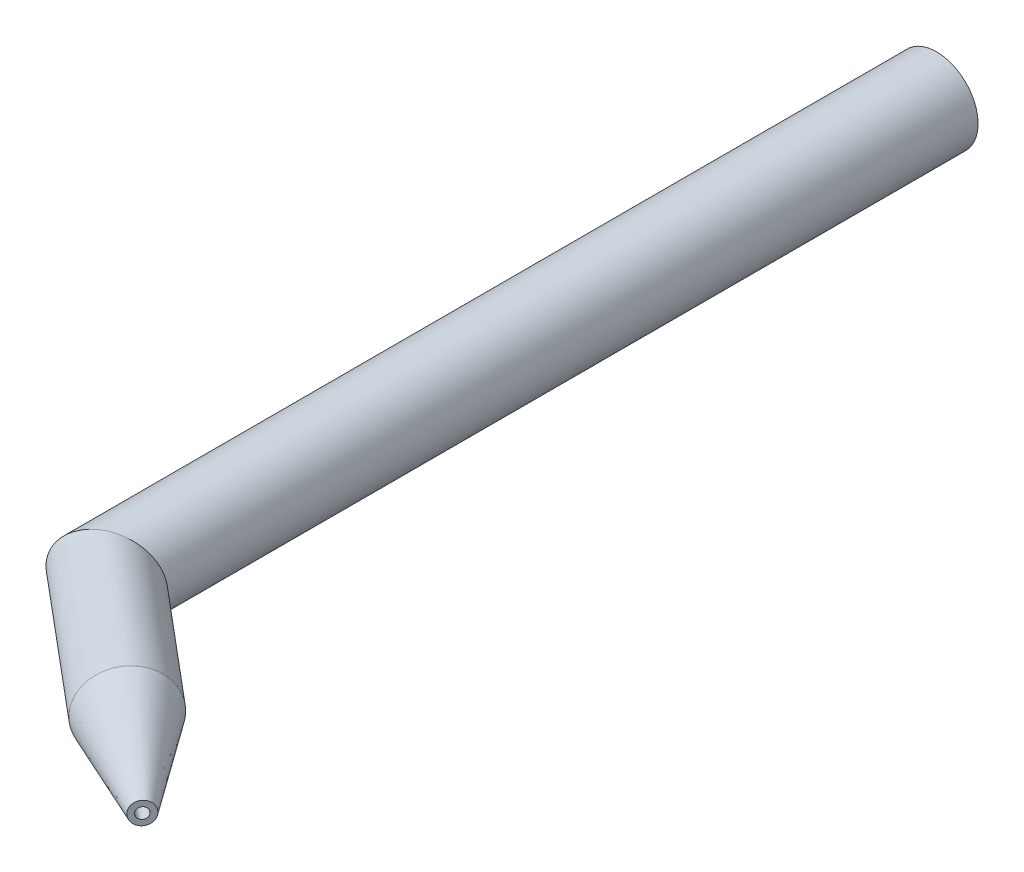
ISO-10303-21;
HEADER;
FILE_DESCRIPTION(('STEP AP214'),'2;1');
FILE_NAME('part.step','',(''),(''),'','','');
FILE_SCHEMA(('AUTOMOTIVE_DESIGN { 1 0 10303 214 1 1 1 1 }'));
ENDSEC;
DATA;
#1=APPLICATION_CONTEXT('core data for automotive mechanical design processes');
#2=APPLICATION_PROTOCOL_DEFINITION('international standard','automotive_design',2000,#1);
#3=PRODUCT_CONTEXT('',#1,'mechanical');
#4=PRODUCT('Part','Part','',(#3));
#5=PRODUCT_RELATED_PRODUCT_CATEGORY('part','',(#4));
#6=PRODUCT_DEFINITION_FORMATION('','',#4);
#7=PRODUCT_DEFINITION_CONTEXT('part definition',#1,'design');
#8=PRODUCT_DEFINITION('design','',#6,#7);
#9=PRODUCT_DEFINITION_SHAPE('','',#8);
#10=(LENGTH_UNIT() NAMED_UNIT(*) SI_UNIT(.MILLI.,.METRE.));
#11=(NAMED_UNIT(*) PLANE_ANGLE_UNIT() SI_UNIT($,.RADIAN.));
#12=(NAMED_UNIT(*) SI_UNIT($,.STERADIAN.) SOLID_ANGLE_UNIT());
#13=UNCERTAINTY_MEASURE_WITH_UNIT(LENGTH_MEASURE(1.E-05),#10,'distance_accuracy_value','');
#14=(GEOMETRIC_REPRESENTATION_CONTEXT(3) GLOBAL_UNCERTAINTY_ASSIGNED_CONTEXT((#13)) GLOBAL_UNIT_ASSIGNED_CONTEXT((#10,
#11,#12)) REPRESENTATION_CONTEXT('',''));
#15=CARTESIAN_POINT('',(0.,0.,0.));
#16=DIRECTION('',(0.,0.,1.));
#17=DIRECTION('',(1.,0.,0.));
#18=AXIS2_PLACEMENT_3D('',#15,#16,#17);
#19=CARTESIAN_POINT('',(0.,0.,100.));
#20=DIRECTION('',(0.,0.,-1.));
#21=DIRECTION('',(-1.,0.,0.));
#22=AXIS2_PLACEMENT_3D('',#19,#20,#21);
#23=CYLINDRICAL_SURFACE('',#22,7.5);
#24=CARTESIAN_POINT('',(0.,0.,130.));
#25=DIRECTION('',(0.422618261740702,0.,0.906307787036648));
#26=DIRECTION('',(-0.906307787036649,0.,0.422618261740702));
#27=AXIS2_PLACEMENT_3D('',#24,#25,#26);
#28=ELLIPSE('',#27,8.2753343922187,7.5);
#29=CARTESIAN_POINT('',(-7.49999999999998,0.,133.497307436163));
#30=VERTEX_POINT('',#29);
#31=EDGE_CURVE('E40',#30,#30,#28,.F.);
#32=ORIENTED_EDGE('',*,*,#31,.T.);
#33=EDGE_LOOP('',(#32));
#34=FACE_BOUND('',#33,.T.);
#35=CARTESIAN_POINT('',(0.,0.,-20.));
#36=DIRECTION('',(0.,0.,-1.));
#37=DIRECTION('',(-1.,0.,0.));
#38=AXIS2_PLACEMENT_3D('',#35,#36,#37);
#39=CIRCLE('',#38,7.5);
#40=CARTESIAN_POINT('',(-7.5,0.,-20.));
#41=VERTEX_POINT('',#40);
#42=EDGE_CURVE('E76',#41,#41,#39,.T.);
#43=ORIENTED_EDGE('',*,*,#42,.F.);
#44=EDGE_LOOP('',(#43));
#45=FACE_BOUND('',#44,.T.);
#46=ADVANCED_FACE('F37',(#34,#45),#23,.T.);
#47=CARTESIAN_POINT('',(0.,0.,100.));
#48=DIRECTION('',(0.,0.,-1.));
#49=DIRECTION('',(-1.,0.,0.));
#50=AXIS2_PLACEMENT_3D('',#47,#48,#49);
#51=CYLINDRICAL_SURFACE('',#50,4.5);
#52=CARTESIAN_POINT('',(0.,0.,130.));
#53=DIRECTION('',(0.422618261740702,0.,0.906307787036649));
#54=DIRECTION('',(-0.906307787036649,0.,0.422618261740702));
#55=AXIS2_PLACEMENT_3D('',#52,#53,#54);
#56=ELLIPSE('',#55,4.96520063533122,4.5);
#57=CARTESIAN_POINT('',(-4.49999999999998,0.,132.098384461698));
#58=VERTEX_POINT('',#57);
#59=EDGE_CURVE('E10',#58,#58,#56,.T.);
#60=ORIENTED_EDGE('',*,*,#59,.T.);
#61=EDGE_LOOP('',(#60));
#62=FACE_BOUND('',#61,.T.);
#63=CARTESIAN_POINT('',(0.,0.,-20.));
#64=DIRECTION('',(0.,0.,-1.));
#65=DIRECTION('',(-1.,0.,0.));
#66=AXIS2_PLACEMENT_3D('',#63,#64,#65);
#67=CIRCLE('',#66,4.5);
#68=CARTESIAN_POINT('',(-4.5,0.,-20.));
#69=VERTEX_POINT('',#68);
#70=EDGE_CURVE('E82',#69,#69,#67,.T.);
#71=ORIENTED_EDGE('',*,*,#70,.T.);
#72=EDGE_LOOP('',(#71));
#73=FACE_BOUND('',#72,.T.);
#74=ADVANCED_FACE('F87',(#62,#73),#51,.F.);
#75=CARTESIAN_POINT('',(-3.02360666439797,0.,127.462892763079));
#76=DIRECTION('',(0.766044443118982,0.,0.642787609686535));
#77=DIRECTION('',(0.642787609686535,0.,-0.766044443118982));
#78=AXIS2_PLACEMENT_3D('',#75,#76,#77);
#79=CYLINDRICAL_SURFACE('',#78,7.5);
#80=ORIENTED_EDGE('',*,*,#31,.F.);
#81=EDGE_LOOP('',(#80));
#82=FACE_BOUND('',#81,.T.);
#83=CARTESIAN_POINT('',(22.9813332935695,0.,149.283628290596));
#84=DIRECTION('',(0.766044443118981,0.,0.642787609686535));
#85=DIRECTION('',(0.642787609686535,0.,-0.766044443118981));
#86=AXIS2_PLACEMENT_3D('',#83,#84,#85);
#87=CIRCLE('',#86,7.5);
#88=CARTESIAN_POINT('',(18.1604262209204,0.,155.028961613988));
#89=VERTEX_POINT('',#88);
#90=EDGE_CURVE('E51',#89,#89,#87,.T.);
#91=ORIENTED_EDGE('',*,*,#90,.F.);
#92=EDGE_LOOP('',(#91));
#93=FACE_BOUND('',#92,.T.);
#94=ADVANCED_FACE('F104',(#82,#93),#79,.T.);
#95=CARTESIAN_POINT('',(-1.84480577636353,0.,128.45202415346));
#96=DIRECTION('',(0.766044443118982,0.,0.642787609686535));
#97=DIRECTION('',(0.642787609686535,0.,-0.766044443118982));
#98=AXIS2_PLACEMENT_3D('',#95,#96,#97);
#99=CYLINDRICAL_SURFACE('',#98,4.5);
#100=ORIENTED_EDGE('',*,*,#59,.F.);
#101=EDGE_LOOP('',(#100));
#102=FACE_BOUND('',#101,.T.);
#103=CARTESIAN_POINT('',(22.9813332935695,0.,149.283628290596));
#104=DIRECTION('',(0.766044443118981,0.,0.642787609686535));
#105=DIRECTION('',(0.642787609686535,0.,-0.766044443118981));
#106=AXIS2_PLACEMENT_3D('',#103,#104,#105);
#107=CIRCLE('',#106,4.5);
#108=CARTESIAN_POINT('',(20.08878904998,0.,152.730828284632));
#109=VERTEX_POINT('',#108);
#110=EDGE_CURVE('E45',#109,#109,#107,.F.);
#111=ORIENTED_EDGE('',*,*,#110,.F.);
#112=EDGE_LOOP('',(#111));
#113=FACE_BOUND('',#112,.T.);
#114=ADVANCED_FACE('F105',(#102,#113),#99,.F.);
#115=CARTESIAN_POINT('',(39.8797337504336,0.,163.463069881437));
#116=DIRECTION('',(-0.76604444311898,0.,-0.642787609686537));
#117=DIRECTION('',(-0.642787609686537,0.,0.76604444311898));
#118=AXIS2_PLACEMENT_3D('',#115,#116,#117);
#119=CONICAL_SURFACE('',#118,2.00000000000007,0.244346095279214);
#120=CARTESIAN_POINT('',(39.8797337504336,0.,163.463069881437));
#121=DIRECTION('',(-0.76604444311898,0.,-0.642787609686537));
#122=DIRECTION('',(-0.642787609686537,0.,0.76604444311898));
#123=AXIS2_PLACEMENT_3D('',#120,#121,#122);
#124=CIRCLE('',#123,2.00000000000007);
#125=CARTESIAN_POINT('',(38.5941585310604,0.,164.995158767675));
#126=VERTEX_POINT('',#125);
#127=EDGE_CURVE('E54',#126,#126,#124,.T.);
#128=CARTESIAN_POINT('',(18.1604262209204,0.,155.028961613988));
#129=CARTESIAN_POINT('',(18.373277599151,0.,155.132776167673));
#130=CARTESIAN_POINT('',(18.5861289773816,0.,155.236590721357));
#131=CARTESIAN_POINT('',(19.0118317338429,0.,155.444219828725));
#132=CARTESIAN_POINT('',(19.2246831120735,0.,155.54803438241));
#133=CARTESIAN_POINT('',(19.6503858685348,0.,155.755663489778));
#134=CARTESIAN_POINT('',(19.8632372467654,0.,155.859478043462));
#135=CARTESIAN_POINT('',(20.2889400032266,0.,156.067107150831));
#136=CARTESIAN_POINT('',(20.5017913814573,0.,156.170921704515));
#137=CARTESIAN_POINT('',(20.9274941379185,0.,156.378550811884));
#138=CARTESIAN_POINT('',(21.1403455161491,0.,156.482365365568));
#139=CARTESIAN_POINT('',(21.5660482726104,0.,156.689994472936));
#140=CARTESIAN_POINT('',(21.778899650841,0.,156.79380902662));
#141=CARTESIAN_POINT('',(22.2046024073023,0.,157.001438133989));
#142=CARTESIAN_POINT('',(22.4174537855329,0.,157.105252687673));
#143=CARTESIAN_POINT('',(22.8431565419941,0.,157.312881795042));
#144=CARTESIAN_POINT('',(23.0560079202248,0.,157.416696348726));
#145=CARTESIAN_POINT('',(23.481710676686,0.,157.624325456094));
#146=CARTESIAN_POINT('',(23.6945620549167,0.,157.728140009779));
#147=CARTESIAN_POINT('',(24.1202648113779,0.,157.935769117147));
#148=CARTESIAN_POINT('',(24.3331161896085,0.,158.039583670831));
#149=CARTESIAN_POINT('',(24.7588189460698,0.,158.2472127782));
#150=CARTESIAN_POINT('',(24.9716703243004,0.,158.351027331884));
#151=CARTESIAN_POINT('',(25.3973730807617,0.,158.558656439252));
#152=CARTESIAN_POINT('',(25.6102244589923,0.,158.662470992937));
#153=CARTESIAN_POINT('',(26.0359272154535,0.,158.870100100305));
#154=CARTESIAN_POINT('',(26.2487785936842,0.,158.973914653989));
#155=CARTESIAN_POINT('',(26.6744813501454,0.,159.181543761358));
#156=CARTESIAN_POINT('',(26.887332728376,0.,159.285358315042));
#157=CARTESIAN_POINT('',(27.3130354848373,0.,159.49298742241));
#158=CARTESIAN_POINT('',(27.5258868630679,0.,159.596801976095));
#159=CARTESIAN_POINT('',(27.9515896195292,0.,159.804431083463));
#160=CARTESIAN_POINT('',(28.1644409977598,0.,159.908245637147));
#161=CARTESIAN_POINT('',(28.590143754221,0.,160.115874744516));
#162=CARTESIAN_POINT('',(28.8029951324517,0.,160.2196892982));
#163=CARTESIAN_POINT('',(29.2286978889129,0.,160.427318405569));
#164=CARTESIAN_POINT('',(29.4415492671435,0.,160.531132959253));
#165=CARTESIAN_POINT('',(29.8672520236048,0.,160.738762066621));
#166=CARTESIAN_POINT('',(30.0801034018354,0.,160.842576620305));
#167=CARTESIAN_POINT('',(30.5058061582967,0.,161.050205727674));
#168=CARTESIAN_POINT('',(30.7186575365273,0.,161.154020281358));
#169=CARTESIAN_POINT('',(31.1443602929885,0.,161.361649388727));
#170=CARTESIAN_POINT('',(31.3572116712192,0.,161.465463942411));
#171=CARTESIAN_POINT('',(31.7829144276804,0.,161.673093049779));
#172=CARTESIAN_POINT('',(31.995765805911,0.,161.776907603464));
#173=CARTESIAN_POINT('',(32.4214685623723,0.,161.984536710832));
#174=CARTESIAN_POINT('',(32.6343199406029,0.,162.088351264516));
#175=CARTESIAN_POINT('',(33.0600226970642,0.,162.295980371885));
#176=CARTESIAN_POINT('',(33.2728740752948,0.,162.399794925569));
#177=CARTESIAN_POINT('',(33.6985768317561,0.,162.607424032937));
#178=CARTESIAN_POINT('',(33.9114282099867,0.,162.711238586622));
#179=CARTESIAN_POINT('',(34.3371309664479,0.,162.91886769399));
#180=CARTESIAN_POINT('',(34.5499823446786,0.,163.022682247674));
#181=CARTESIAN_POINT('',(34.9756851011398,0.,163.230311355043));
#182=CARTESIAN_POINT('',(35.1885364793704,0.,163.334125908727));
#183=CARTESIAN_POINT('',(35.6142392358317,0.,163.541755016095));
#184=CARTESIAN_POINT('',(35.8270906140623,0.,163.64556956978));
#185=CARTESIAN_POINT('',(36.2527933705236,0.,163.853198677148));
#186=CARTESIAN_POINT('',(36.4656447487542,0.,163.957013230832));
#187=CARTESIAN_POINT('',(36.8913475052154,0.,164.164642338201));
#188=CARTESIAN_POINT('',(37.1041988834461,0.,164.268456891885));
#189=CARTESIAN_POINT('',(37.5299016399073,0.,164.476085999254));
#190=CARTESIAN_POINT('',(37.7427530181379,0.,164.579900552938));
#191=CARTESIAN_POINT('',(38.1684557745992,0.,164.787529660306));
#192=CARTESIAN_POINT('',(38.3813071528298,0.,164.89134421399));
#193=CARTESIAN_POINT('',(38.5941585310604,0.,164.995158767675));
#194=B_SPLINE_CURVE_WITH_KNOTS('',3,(#128,#129,#130,#131,#132,#133,#134,#135,#136,#137,#138,
#139,#140,#141,#142,#143,#144,#145,#146,#147,#148,#149,#150,#151,#152,#153,#154,#155,#156,#157,
#158,#159,#160,#161,#162,#163,#164,#165,#166,#167,#168,#169,#170,#171,#172,#173,#174,#175,#176,
#177,#178,#179,#180,#181,#182,#183,#184,#185,#186,#187,#188,#189,#190,#191,#192,#193),
.UNSPECIFIED.,.F.,.F.,(4,2,2,2,2,2,2,2,2,2,2,2,2,2,2,2,2,2,2,2,2,2,2,2,2,2,2,2,2,2,2,2,4),(0.,
0.710456569356622,1.42091313871327,2.1313697080699,2.84182627742654,3.55228284678316,
4.2627394161398,4.97319598549643,5.68365255485306,6.3941091242097,7.10456569356634,
7.81502226292297,8.52547883227959,9.23593540163623,9.94639197099286,10.6568485403495,
11.3673051097061,12.0777616790628,12.7882182484194,13.498674817776,14.2091313871327,
14.9195879564893,15.6300445258459,16.3405010952026,17.0509576645592,17.7614142339158,
18.4718708032725,19.1823273726291,19.8927839419857,20.6032405113424,21.313697080699,
22.0241536500556,22.7346102194123),.UNSPECIFIED.);
#195=EDGE_CURVE('BSEAM113',#89,#126,#194,.T.);
#196=ORIENTED_EDGE('',*,*,#90,.T.);
#197=ORIENTED_EDGE('',*,*,#127,.T.);
#198=ORIENTED_EDGE('',*,*,#195,.T.);
#199=ORIENTED_EDGE('',*,*,#195,.F.);
#200=EDGE_LOOP('',(#196,#198,#197,#199));
#201=FACE_BOUND('',#200,.T.);
#202=ADVANCED_FACE('F113',(#201),#119,.T.);
#203=CARTESIAN_POINT('',(41.1653089698068,0.,161.930980995199));
#204=DIRECTION('',(-0.76604444311898,0.,-0.642787609686537));
#205=DIRECTION('',(-0.642787609686537,0.,0.76604444311898));
#206=AXIS2_PLACEMENT_3D('',#203,#204,#205);
#207=PLANE('',#206);
#208=ORIENTED_EDGE('',*,*,#127,.F.);
#209=EDGE_LOOP('',(#208));
#210=FACE_BOUND('',#209,.T.);
#211=CARTESIAN_POINT('',(39.8797337504338,0.,163.463069881437));
#212=DIRECTION('',(-0.76604444311898,0.,-0.642787609686537));
#213=DIRECTION('',(-0.642787609686537,0.,0.76604444311898));
#214=AXIS2_PLACEMENT_3D('',#211,#212,#213);
#215=CIRCLE('',#214,1.);
#216=CARTESIAN_POINT('',(39.2369461407472,0.,164.229114324556));
#217=VERTEX_POINT('',#216);
#218=EDGE_CURVE('E66',#217,#217,#215,.T.);
#219=ORIENTED_EDGE('',*,*,#218,.T.);
#220=EDGE_LOOP('',(#219));
#221=FACE_BOUND('',#220,.T.);
#222=ADVANCED_FACE('F120',(#210,#221),#207,.F.);
#223=CARTESIAN_POINT('',(0.,0.,130.));
#224=DIRECTION('',(-0.76604444311898,0.,-0.642787609686537));
#225=DIRECTION('',(-0.642787609686537,0.,0.76604444311898));
#226=AXIS2_PLACEMENT_3D('',#223,#224,#225);
#227=CYLINDRICAL_SURFACE('',#226,1.00000000000001);
#228=ORIENTED_EDGE('',*,*,#218,.F.);
#229=EDGE_LOOP('',(#228));
#230=FACE_BOUND('',#229,.T.);
#231=CARTESIAN_POINT('',(32.987542032585,0.,157.679834352987));
#232=DIRECTION('',(-0.76604444311898,0.,-0.642787609686537));
#233=DIRECTION('',(-0.642787609686537,0.,0.76604444311898));
#234=AXIS2_PLACEMENT_3D('',#231,#232,#233);
#235=CIRCLE('',#234,1.00000000000003);
#236=CARTESIAN_POINT('',(32.3447544228984,0.,158.445878796106));
#237=VERTEX_POINT('',#236);
#238=EDGE_CURVE('E71',#237,#237,#235,.T.);
#239=ORIENTED_EDGE('',*,*,#238,.T.);
#240=EDGE_LOOP('',(#239));
#241=FACE_BOUND('',#240,.T.);
#242=ADVANCED_FACE('F97',(#230,#241),#227,.F.);
#243=CARTESIAN_POINT('',(22.9813332935694,0.,149.283628290596));
#244=DIRECTION('',(-0.76604444311898,0.,-0.642787609686537));
#245=DIRECTION('',(-0.642787609686537,0.,0.76604444311898));
#246=AXIS2_PLACEMENT_3D('',#243,#244,#245);
#247=CONICAL_SURFACE('',#246,4.50000000000008,0.261799387799151);
#248=CARTESIAN_POINT('',(32.3447544228984,0.,158.445878796106));
#249=CARTESIAN_POINT('',(32.2170881169305,0.,158.386347019945));
#250=CARTESIAN_POINT('',(32.0894218109626,0.,158.326815243783));
#251=CARTESIAN_POINT('',(31.8340891990268,0.,158.207751691461));
#252=CARTESIAN_POINT('',(31.7064228930589,0.,158.1482199153));
#253=CARTESIAN_POINT('',(31.4510902811231,0.,158.029156362978));
#254=CARTESIAN_POINT('',(31.3234239751552,0.,157.969624586816));
#255=CARTESIAN_POINT('',(31.0680913632194,0.,157.850561034494));
#256=CARTESIAN_POINT('',(30.9404250572515,0.,157.791029258333));
#257=CARTESIAN_POINT('',(30.6850924453157,0.,157.67196570601));
#258=CARTESIAN_POINT('',(30.5574261393478,0.,157.612433929849));
#259=CARTESIAN_POINT('',(30.302093527412,0.,157.493370377527));
#260=CARTESIAN_POINT('',(30.1744272214441,0.,157.433838601366));
#261=CARTESIAN_POINT('',(29.9190946095083,0.,157.314775049043));
#262=CARTESIAN_POINT('',(29.7914283035404,0.,157.255243272882));
#263=CARTESIAN_POINT('',(29.5360956916046,0.,157.13617972056));
#264=CARTESIAN_POINT('',(29.4084293856367,0.,157.076647944399));
#265=CARTESIAN_POINT('',(29.1530967737009,0.,156.957584392076));
#266=CARTESIAN_POINT('',(29.025430467733,0.,156.898052615915));
#267=CARTESIAN_POINT('',(28.7700978557972,0.,156.778989063593));
#268=CARTESIAN_POINT('',(28.6424315498293,0.,156.719457287431));
#269=CARTESIAN_POINT('',(28.3870989378935,0.,156.600393735109));
#270=CARTESIAN_POINT('',(28.2594326319256,0.,156.540861958948));
#271=CARTESIAN_POINT('',(28.0041000199898,0.,156.421798406625));
#272=CARTESIAN_POINT('',(27.8764337140219,0.,156.362266630464));
#273=CARTESIAN_POINT('',(27.6211011020861,0.,156.243203078142));
#274=CARTESIAN_POINT('',(27.4934347961182,0.,156.183671301981));
#275=CARTESIAN_POINT('',(27.2381021841824,0.,156.064607749658));
#276=CARTESIAN_POINT('',(27.1104358782145,0.,156.005075973497));
#277=CARTESIAN_POINT('',(26.8551032662787,0.,155.886012421175));
#278=CARTESIAN_POINT('',(26.7274369603108,0.,155.826480645013));
#279=CARTESIAN_POINT('',(26.472104348375,0.,155.707417092691));
#280=CARTESIAN_POINT('',(26.3444380424071,0.,155.64788531653));
#281=CARTESIAN_POINT('',(26.0891054304713,0.,155.528821764208));
#282=CARTESIAN_POINT('',(25.9614391245034,0.,155.469289988046));
#283=CARTESIAN_POINT('',(25.7061065125676,0.,155.350226435724));
#284=CARTESIAN_POINT('',(25.5784402065997,0.,155.290694659563));
#285=CARTESIAN_POINT('',(25.3231075946639,0.,155.17163110724));
#286=CARTESIAN_POINT('',(25.195441288696,0.,155.112099331079));
#287=CARTESIAN_POINT('',(24.9401086767602,0.,154.993035778757));
#288=CARTESIAN_POINT('',(24.8124423707923,0.,154.933504002596));
#289=CARTESIAN_POINT('',(24.5571097588565,0.,154.814440450273));
#290=CARTESIAN_POINT('',(24.4294434528886,0.,154.754908674112));
#291=CARTESIAN_POINT('',(24.1741108409528,0.,154.63584512179));
#292=CARTESIAN_POINT('',(24.0464445349849,0.,154.576313345628));
#293=CARTESIAN_POINT('',(23.7911119230491,0.,154.457249793306));
#294=CARTESIAN_POINT('',(23.6634456170812,0.,154.397718017145));
#295=CARTESIAN_POINT('',(23.4081130051454,0.,154.278654464823));
#296=CARTESIAN_POINT('',(23.2804466991775,0.,154.219122688661));
#297=CARTESIAN_POINT('',(23.0251140872417,0.,154.100059136339));
#298=CARTESIAN_POINT('',(22.8974477812738,0.,154.040527360178));
#299=CARTESIAN_POINT('',(22.642115169338,0.,153.921463807855));
#300=CARTESIAN_POINT('',(22.5144488633701,0.,153.861932031694));
#301=CARTESIAN_POINT('',(22.2591162514343,0.,153.742868479372));
#302=CARTESIAN_POINT('',(22.1314499454664,0.,153.683336703211));
#303=CARTESIAN_POINT('',(21.8761173335306,0.,153.564273150888));
#304=CARTESIAN_POINT('',(21.7484510275627,0.,153.504741374727));
#305=CARTESIAN_POINT('',(21.4931184156269,0.,153.385677822405));
#306=CARTESIAN_POINT('',(21.365452109659,0.,153.326146046244));
#307=CARTESIAN_POINT('',(21.1101194977232,0.,153.207082493921));
#308=CARTESIAN_POINT('',(20.9824531917553,0.,153.14755071776));
#309=CARTESIAN_POINT('',(20.7271205798195,0.,153.028487165438));
#310=CARTESIAN_POINT('',(20.5994542738516,0.,152.968955389276));
#311=CARTESIAN_POINT('',(20.3441216619158,0.,152.849891836954));
#312=CARTESIAN_POINT('',(20.2164553559479,0.,152.790360060793));
#313=CARTESIAN_POINT('',(20.08878904998,0.,152.730828284632));
#314=B_SPLINE_CURVE_WITH_KNOTS('',3,(#248,#249,#250,#251,#252,#253,#254,#255,#256,#257,#258,
#259,#260,#261,#262,#263,#264,#265,#266,#267,#268,#269,#270,#271,#272,#273,#274,#275,#276,#277,
#278,#279,#280,#281,#282,#283,#284,#285,#286,#287,#288,#289,#290,#291,#292,#293,#294,#295,#296,
#297,#298,#299,#300,#301,#302,#303,#304,#305,#306,#307,#308,#309,#310,#311,#312,#313),
.UNSPECIFIED.,.F.,.F.,(4,2,2,2,2,2,2,2,2,2,2,2,2,2,2,2,2,2,2,2,2,2,2,2,2,2,2,2,2,2,2,2,4),(0.,
0.422592549001484,0.845185098002945,1.26777764700442,1.69037019600588,2.11296274500737,
2.53555529400883,2.9581478430103,3.38074039201178,3.80333294101325,4.22592549001473,
4.64851803901619,5.07111058801766,5.49370313701912,5.91629568602061,6.33888823502208,
6.76148078402354,7.18407333302502,7.60666588202649,8.02925843102796,8.45185098002943,
8.8744435290309,9.29703607803238,9.71962862703384,10.1422211760353,10.5648137250368,
10.9874062740383,11.4099988230397,11.8325913720412,12.2551839210427,12.6777764700441,
13.1003690190456,13.5229615680471),.UNSPECIFIED.);
#315=EDGE_CURVE('BSEAM91',#237,#109,#314,.T.);
#316=ORIENTED_EDGE('',*,*,#238,.F.);
#317=ORIENTED_EDGE('',*,*,#110,.T.);
#318=ORIENTED_EDGE('',*,*,#315,.T.);
#319=ORIENTED_EDGE('',*,*,#315,.F.);
#320=EDGE_LOOP('',(#316,#318,#317,#319));
#321=FACE_BOUND('',#320,.T.);
#322=ADVANCED_FACE('F91',(#321),#247,.F.);
#323=CARTESIAN_POINT('',(0.,0.,-20.));
#324=DIRECTION('',(0.,0.,-1.));
#325=DIRECTION('',(-1.,0.,0.));
#326=AXIS2_PLACEMENT_3D('',#323,#324,#325);
#327=PLANE('',#326);
#328=ORIENTED_EDGE('',*,*,#42,.T.);
#329=EDGE_LOOP('',(#328));
#330=FACE_BOUND('',#329,.T.);
#331=ORIENTED_EDGE('',*,*,#70,.F.);
#332=EDGE_LOOP('',(#331));
#333=FACE_BOUND('',#332,.T.);
#334=ADVANCED_FACE('F89',(#330,#333),#327,.T.);
#335=CLOSED_SHELL('',(#46,#74,#94,#114,#202,#222,#242,#322,#334));
#336=MANIFOLD_SOLID_BREP('B2',#335);
#337=ADVANCED_BREP_SHAPE_REPRESENTATION('',(#18,#336),#14);
#338=SHAPE_DEFINITION_REPRESENTATION(#9,#337);
ENDSEC;
END-ISO-10303-21;
